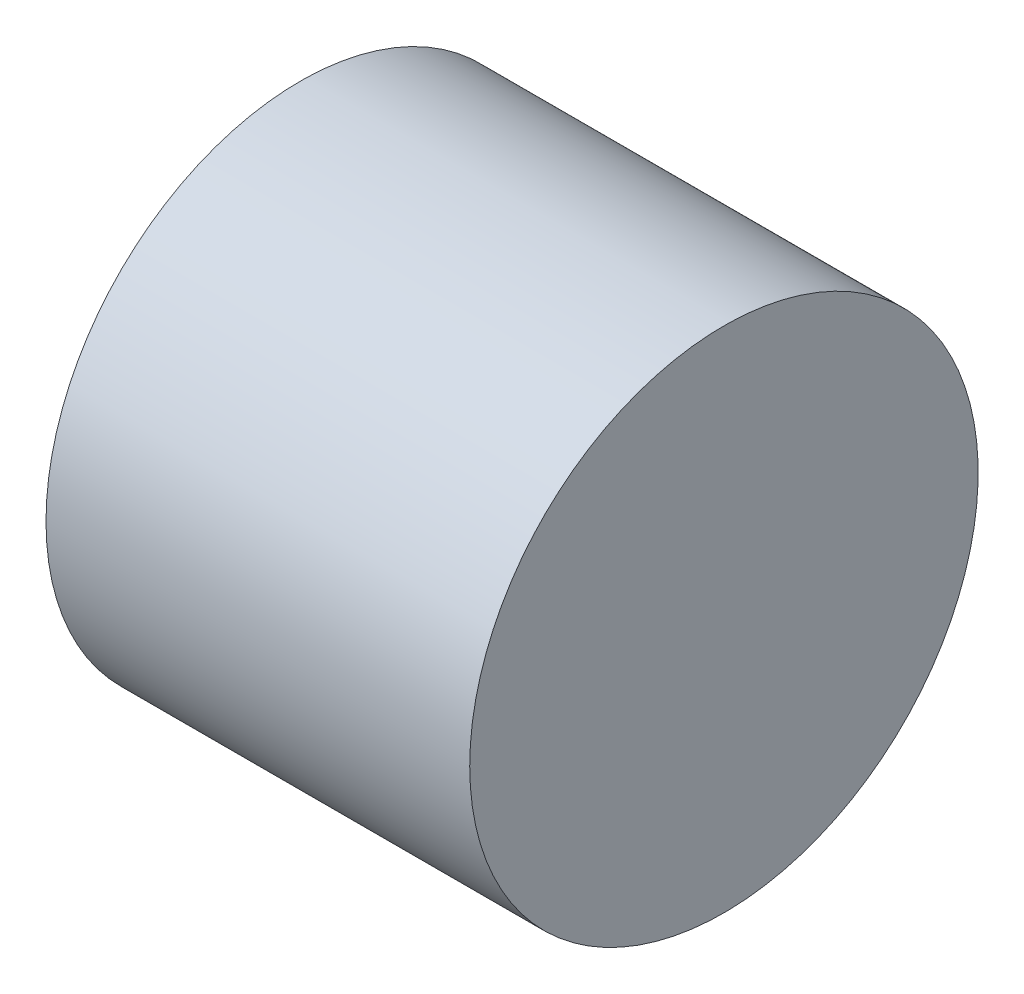
ISO-10303-21;
HEADER;
FILE_DESCRIPTION(('STEP AP214'),'2;1');
FILE_NAME('part.step','',(''),(''),'','','');
FILE_SCHEMA(('AUTOMOTIVE_DESIGN { 1 0 10303 214 1 1 1 1 }'));
ENDSEC;
DATA;
#1=APPLICATION_CONTEXT('core data for automotive mechanical design processes');
#2=APPLICATION_PROTOCOL_DEFINITION('international standard','automotive_design',2000,#1);
#3=PRODUCT_CONTEXT('',#1,'mechanical');
#4=PRODUCT('Part','Part','',(#3));
#5=PRODUCT_RELATED_PRODUCT_CATEGORY('part','',(#4));
#6=PRODUCT_DEFINITION_FORMATION('','',#4);
#7=PRODUCT_DEFINITION_CONTEXT('part definition',#1,'design');
#8=PRODUCT_DEFINITION('design','',#6,#7);
#9=PRODUCT_DEFINITION_SHAPE('','',#8);
#10=(LENGTH_UNIT() NAMED_UNIT(*) SI_UNIT(.MILLI.,.METRE.));
#11=(NAMED_UNIT(*) PLANE_ANGLE_UNIT() SI_UNIT($,.RADIAN.));
#12=(NAMED_UNIT(*) SI_UNIT($,.STERADIAN.) SOLID_ANGLE_UNIT());
#13=UNCERTAINTY_MEASURE_WITH_UNIT(LENGTH_MEASURE(1.E-05),#10,'distance_accuracy_value','');
#14=(GEOMETRIC_REPRESENTATION_CONTEXT(3) GLOBAL_UNCERTAINTY_ASSIGNED_CONTEXT((#13)) GLOBAL_UNIT_ASSIGNED_CONTEXT((#10,
#11,#12)) REPRESENTATION_CONTEXT('',''));
#15=CARTESIAN_POINT('',(0.,0.,0.));
#16=DIRECTION('',(0.,0.,1.));
#17=DIRECTION('',(1.,0.,0.));
#18=AXIS2_PLACEMENT_3D('',#15,#16,#17);
#19=CARTESIAN_POINT('',(-17.,6.,0.));
#20=DIRECTION('',(1.,0.,0.));
#21=DIRECTION('',(0.,0.,-1.));
#22=AXIS2_PLACEMENT_3D('',#19,#20,#21);
#23=PLANE('',#22);
#24=CARTESIAN_POINT('',(-17.,0.,0.));
#25=DIRECTION('',(-1.,0.,0.));
#26=DIRECTION('',(0.,0.,1.));
#27=AXIS2_PLACEMENT_3D('',#24,#25,#26);
#28=CIRCLE('',#27,6.);
#29=CARTESIAN_POINT('',(-17.,0.,6.));
#30=VERTEX_POINT('',#29);
#31=EDGE_CURVE('E42',#30,#30,#28,.T.);
#32=ORIENTED_EDGE('',*,*,#31,.T.);
#33=EDGE_LOOP('',(#32));
#34=FACE_BOUND('',#33,.T.);
#35=ADVANCED_FACE('F35',(#34),#23,.F.);
#36=CARTESIAN_POINT('',(-7.,0.,0.));
#37=DIRECTION('',(-1.,0.,0.));
#38=DIRECTION('',(0.,0.,1.));
#39=AXIS2_PLACEMENT_3D('',#36,#37,#38);
#40=PLANE('',#39);
#41=CARTESIAN_POINT('',(-7.,0.,0.));
#42=DIRECTION('',(-1.,0.,0.));
#43=DIRECTION('',(0.,0.,1.));
#44=AXIS2_PLACEMENT_3D('',#41,#42,#43);
#45=CIRCLE('',#44,6.);
#46=CARTESIAN_POINT('',(-7.,0.,6.));
#47=VERTEX_POINT('',#46);
#48=EDGE_CURVE('E10',#47,#47,#45,.T.);
#49=ORIENTED_EDGE('',*,*,#48,.F.);
#50=EDGE_LOOP('',(#49));
#51=FACE_BOUND('',#50,.T.);
#52=ADVANCED_FACE('F52',(#51),#40,.F.);
#53=CARTESIAN_POINT('',(-60.,0.,0.));
#54=DIRECTION('',(-1.,0.,0.));
#55=DIRECTION('',(0.,0.,1.));
#56=AXIS2_PLACEMENT_3D('',#53,#54,#55);
#57=CYLINDRICAL_SURFACE('',#56,6.);
#58=ORIENTED_EDGE('',*,*,#31,.F.);
#59=EDGE_LOOP('',(#58));
#60=FACE_BOUND('',#59,.T.);
#61=ORIENTED_EDGE('',*,*,#48,.T.);
#62=EDGE_LOOP('',(#61));
#63=FACE_BOUND('',#62,.T.);
#64=ADVANCED_FACE('F50',(#60,#63),#57,.T.);
#65=CLOSED_SHELL('',(#35,#52,#64));
#66=MANIFOLD_SOLID_BREP('B2',#65);
#67=ADVANCED_BREP_SHAPE_REPRESENTATION('',(#18,#66),#14);
#68=SHAPE_DEFINITION_REPRESENTATION(#9,#67);
ENDSEC;
END-ISO-10303-21;
